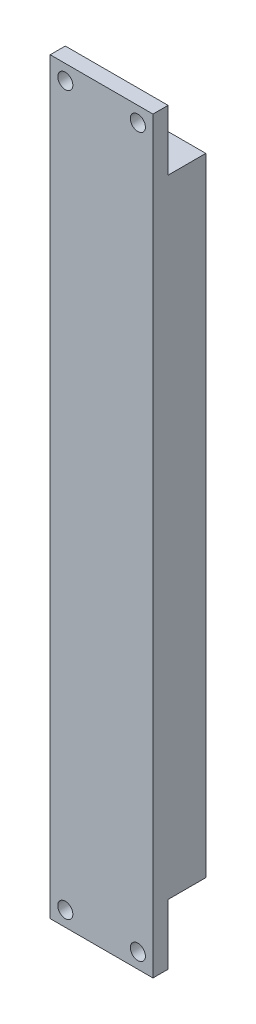
ISO-10303-21;
HEADER;
FILE_DESCRIPTION(('STEP AP214'),'2;1');
FILE_NAME('part.step','',(''),(''),'','','');
FILE_SCHEMA(('AUTOMOTIVE_DESIGN { 1 0 10303 214 1 1 1 1 }'));
ENDSEC;
DATA;
#1=APPLICATION_CONTEXT('core data for automotive mechanical design processes');
#2=APPLICATION_PROTOCOL_DEFINITION('international standard','automotive_design',2000,#1);
#3=PRODUCT_CONTEXT('',#1,'mechanical');
#4=PRODUCT('Part','Part','',(#3));
#5=PRODUCT_RELATED_PRODUCT_CATEGORY('part','',(#4));
#6=PRODUCT_DEFINITION_FORMATION('','',#4);
#7=PRODUCT_DEFINITION_CONTEXT('part definition',#1,'design');
#8=PRODUCT_DEFINITION('design','',#6,#7);
#9=PRODUCT_DEFINITION_SHAPE('','',#8);
#10=(LENGTH_UNIT() NAMED_UNIT(*) SI_UNIT(.MILLI.,.METRE.));
#11=(NAMED_UNIT(*) PLANE_ANGLE_UNIT() SI_UNIT($,.RADIAN.));
#12=(NAMED_UNIT(*) SI_UNIT($,.STERADIAN.) SOLID_ANGLE_UNIT());
#13=UNCERTAINTY_MEASURE_WITH_UNIT(LENGTH_MEASURE(1.E-05),#10,'distance_accuracy_value','');
#14=(GEOMETRIC_REPRESENTATION_CONTEXT(3) GLOBAL_UNCERTAINTY_ASSIGNED_CONTEXT((#13)) GLOBAL_UNIT_ASSIGNED_CONTEXT((#10,
#11,#12)) REPRESENTATION_CONTEXT('',''));
#15=CARTESIAN_POINT('',(0.,0.,0.));
#16=DIRECTION('',(0.,0.,1.));
#17=DIRECTION('',(1.,0.,0.));
#18=AXIS2_PLACEMENT_3D('',#15,#16,#17);
#19=CARTESIAN_POINT('',(0.,0.,0.));
#20=DIRECTION('',(0.,0.,1.));
#21=DIRECTION('',(1.,0.,0.));
#22=AXIS2_PLACEMENT_3D('',#19,#20,#21);
#23=PLANE('',#22);
#24=CARTESIAN_POINT('',(7.62,75.4126,0.));
#25=DIRECTION('',(0.,0.,1.));
#26=DIRECTION('',(1.,0.,0.));
#27=AXIS2_PLACEMENT_3D('',#24,#25,#26);
#28=CIRCLE('',#27,1.5875);
#29=CARTESIAN_POINT('',(9.2075,75.4126,0.));
#30=VERTEX_POINT('',#29);
#31=EDGE_CURVE('E315',#30,#30,#28,.T.);
#32=ORIENTED_EDGE('',*,*,#31,.T.);
#33=EDGE_LOOP('',(#32));
#34=FACE_BOUND('',#33,.T.);
#35=CARTESIAN_POINT('',(-7.62,75.4126,0.));
#36=DIRECTION('',(0.,0.,1.));
#37=DIRECTION('',(1.,0.,0.));
#38=AXIS2_PLACEMENT_3D('',#35,#36,#37);
#39=CIRCLE('',#38,1.5875);
#40=CARTESIAN_POINT('',(-6.0325,75.4126,0.));
#41=VERTEX_POINT('',#40);
#42=EDGE_CURVE('E319',#41,#41,#39,.T.);
#43=ORIENTED_EDGE('',*,*,#42,.T.);
#44=EDGE_LOOP('',(#43));
#45=FACE_BOUND('',#44,.T.);
#46=DIRECTION('',(1.,0.,0.));
#47=VECTOR('',#46,1.);
#48=CARTESIAN_POINT('',(10.795,65.8876,0.));
#49=LINE('',#48,#47);
#50=CARTESIAN_POINT('',(-10.795,65.8876,0.));
#51=VERTEX_POINT('',#50);
#52=CARTESIAN_POINT('',(10.795,65.8876,0.));
#53=VERTEX_POINT('',#52);
#54=EDGE_CURVE('E118',#51,#53,#49,.T.);
#55=ORIENTED_EDGE('',*,*,#54,.F.);
#56=DIRECTION('',(0.,-1.,0.));
#57=VECTOR('',#56,1.);
#58=CARTESIAN_POINT('',(-10.795,-78.5876,0.));
#59=LINE('',#58,#57);
#60=CARTESIAN_POINT('',(-10.795,78.5876,0.));
#61=VERTEX_POINT('',#60);
#62=EDGE_CURVE('E125',#61,#51,#59,.T.);
#63=ORIENTED_EDGE('',*,*,#62,.F.);
#64=DIRECTION('',(-1.,0.,0.));
#65=VECTOR('',#64,1.);
#66=CARTESIAN_POINT('',(10.795,78.5876,0.));
#67=LINE('',#66,#65);
#68=CARTESIAN_POINT('',(10.795,78.5876,0.));
#69=VERTEX_POINT('',#68);
#70=EDGE_CURVE('E135',#69,#61,#67,.T.);
#71=ORIENTED_EDGE('',*,*,#70,.F.);
#72=DIRECTION('',(0.,1.,0.));
#73=VECTOR('',#72,1.);
#74=CARTESIAN_POINT('',(10.795,-78.5876,0.));
#75=LINE('',#74,#73);
#76=EDGE_CURVE('E48',#53,#69,#75,.T.);
#77=ORIENTED_EDGE('',*,*,#76,.F.);
#78=EDGE_LOOP('',(#55,#63,#71,#77));
#79=FACE_BOUND('',#78,.T.);
#80=ADVANCED_FACE('F33',(#34,#45,#79),#23,.F.);
#81=CARTESIAN_POINT('',(-7.62,-75.4126,0.));
#82=DIRECTION('',(0.,0.,1.));
#83=DIRECTION('',(1.,0.,0.));
#84=AXIS2_PLACEMENT_3D('',#81,#82,#83);
#85=CIRCLE('',#84,1.5875);
#86=CARTESIAN_POINT('',(-6.0325,-75.4126,0.));
#87=VERTEX_POINT('',#86);
#88=EDGE_CURVE('E168',#87,#87,#85,.T.);
#89=ORIENTED_EDGE('',*,*,#88,.T.);
#90=EDGE_LOOP('',(#89));
#91=FACE_BOUND('',#90,.T.);
#92=CARTESIAN_POINT('',(7.62,-75.4126,0.));
#93=DIRECTION('',(0.,0.,1.));
#94=DIRECTION('',(1.,0.,0.));
#95=AXIS2_PLACEMENT_3D('',#92,#93,#94);
#96=CIRCLE('',#95,1.5875);
#97=CARTESIAN_POINT('',(9.2075,-75.4126,0.));
#98=VERTEX_POINT('',#97);
#99=EDGE_CURVE('E312',#98,#98,#96,.T.);
#100=ORIENTED_EDGE('',*,*,#99,.T.);
#101=EDGE_LOOP('',(#100));
#102=FACE_BOUND('',#101,.T.);
#103=DIRECTION('',(-1.,0.,0.));
#104=VECTOR('',#103,1.);
#105=CARTESIAN_POINT('',(10.795,-65.8876,0.));
#106=LINE('',#105,#104);
#107=CARTESIAN_POINT('',(10.795,-65.8876,0.));
#108=VERTEX_POINT('',#107);
#109=CARTESIAN_POINT('',(-10.795,-65.8876,0.));
#110=VERTEX_POINT('',#109);
#111=EDGE_CURVE('E56',#108,#110,#106,.T.);
#112=ORIENTED_EDGE('',*,*,#111,.F.);
#113=CARTESIAN_POINT('',(10.795,-78.5876,0.));
#114=VERTEX_POINT('',#113);
#115=EDGE_CURVE('E122',#114,#108,#75,.T.);
#116=ORIENTED_EDGE('',*,*,#115,.F.);
#117=DIRECTION('',(1.,0.,0.));
#118=VECTOR('',#117,1.);
#119=CARTESIAN_POINT('',(10.795,-78.5876,0.));
#120=LINE('',#119,#118);
#121=CARTESIAN_POINT('',(-10.795,-78.5876,0.));
#122=VERTEX_POINT('',#121);
#123=EDGE_CURVE('E143',#122,#114,#120,.T.);
#124=ORIENTED_EDGE('',*,*,#123,.F.);
#125=EDGE_CURVE('E123',#110,#122,#59,.T.);
#126=ORIENTED_EDGE('',*,*,#125,.F.);
#127=EDGE_LOOP('',(#112,#116,#124,#126));
#128=FACE_BOUND('',#127,.T.);
#129=ADVANCED_FACE('F156',(#91,#102,#128),#23,.F.);
#130=CARTESIAN_POINT('',(-10.795,-78.5876,3.175));
#131=DIRECTION('',(1.,0.,0.));
#132=DIRECTION('',(0.,0.,-1.));
#133=AXIS2_PLACEMENT_3D('',#130,#131,#132);
#134=PLANE('',#133);
#135=ORIENTED_EDGE('',*,*,#62,.T.);
#136=DIRECTION('',(0.,0.,1.));
#137=VECTOR('',#136,1.);
#138=CARTESIAN_POINT('',(-10.795,65.8876,-7.9248));
#139=LINE('',#138,#137);
#140=CARTESIAN_POINT('',(-10.795,65.8876,-7.9248));
#141=VERTEX_POINT('',#140);
#142=EDGE_CURVE('E127',#141,#51,#139,.T.);
#143=ORIENTED_EDGE('',*,*,#142,.F.);
#144=DIRECTION('',(0.,1.,0.));
#145=VECTOR('',#144,1.);
#146=CARTESIAN_POINT('',(-10.795,65.8876,-7.9248));
#147=LINE('',#146,#145);
#148=CARTESIAN_POINT('',(-10.795,-65.8876,-7.9248));
#149=VERTEX_POINT('',#148);
#150=EDGE_CURVE('E108',#149,#141,#147,.T.);
#151=ORIENTED_EDGE('',*,*,#150,.F.);
#152=DIRECTION('',(0.,0.,1.));
#153=VECTOR('',#152,1.);
#154=CARTESIAN_POINT('',(-10.795,-65.8876,-7.9248));
#155=LINE('',#154,#153);
#156=EDGE_CURVE('E105',#149,#110,#155,.T.);
#157=ORIENTED_EDGE('',*,*,#156,.T.);
#158=ORIENTED_EDGE('',*,*,#125,.T.);
#159=DIRECTION('',(0.,0.,-1.));
#160=VECTOR('',#159,1.);
#161=CARTESIAN_POINT('',(-10.795,-78.5876,3.175));
#162=LINE('',#161,#160);
#163=CARTESIAN_POINT('',(-10.795,-78.5876,3.175));
#164=VERTEX_POINT('',#163);
#165=EDGE_CURVE('E11',#164,#122,#162,.T.);
#166=ORIENTED_EDGE('',*,*,#165,.F.);
#167=DIRECTION('',(0.,-1.,0.));
#168=VECTOR('',#167,1.);
#169=CARTESIAN_POINT('',(-10.795,-78.5876,3.175));
#170=LINE('',#169,#168);
#171=CARTESIAN_POINT('',(-10.795,78.5876,3.175));
#172=VERTEX_POINT('',#171);
#173=EDGE_CURVE('E131',#172,#164,#170,.T.);
#174=ORIENTED_EDGE('',*,*,#173,.F.);
#175=DIRECTION('',(0.,0.,-1.));
#176=VECTOR('',#175,1.);
#177=CARTESIAN_POINT('',(-10.795,78.5876,3.175));
#178=LINE('',#177,#176);
#179=EDGE_CURVE('E140',#172,#61,#178,.T.);
#180=ORIENTED_EDGE('',*,*,#179,.T.);
#181=EDGE_LOOP('',(#135,#143,#151,#157,#158,#166,#174,#180));
#182=FACE_BOUND('',#181,.T.);
#183=ADVANCED_FACE('F35',(#182),#134,.F.);
#184=CARTESIAN_POINT('',(10.795,-78.5876,3.175));
#185=DIRECTION('',(0.,1.,0.));
#186=DIRECTION('',(-1.,0.,0.));
#187=AXIS2_PLACEMENT_3D('',#184,#185,#186);
#188=PLANE('',#187);
#189=ORIENTED_EDGE('',*,*,#123,.T.);
#190=DIRECTION('',(0.,0.,-1.));
#191=VECTOR('',#190,1.);
#192=CARTESIAN_POINT('',(10.795,-78.5876,3.175));
#193=LINE('',#192,#191);
#194=CARTESIAN_POINT('',(10.795,-78.5876,3.175));
#195=VERTEX_POINT('',#194);
#196=EDGE_CURVE('E41',#195,#114,#193,.T.);
#197=ORIENTED_EDGE('',*,*,#196,.F.);
#198=DIRECTION('',(1.,0.,0.));
#199=VECTOR('',#198,1.);
#200=CARTESIAN_POINT('',(10.795,-78.5876,3.175));
#201=LINE('',#200,#199);
#202=EDGE_CURVE('E134',#164,#195,#201,.T.);
#203=ORIENTED_EDGE('',*,*,#202,.F.);
#204=ORIENTED_EDGE('',*,*,#165,.T.);
#205=EDGE_LOOP('',(#189,#197,#203,#204));
#206=FACE_BOUND('',#205,.T.);
#207=ADVANCED_FACE('F158',(#206),#188,.F.);
#208=CARTESIAN_POINT('',(10.795,-78.5876,3.175));
#209=DIRECTION('',(-1.,0.,0.));
#210=DIRECTION('',(0.,0.,1.));
#211=AXIS2_PLACEMENT_3D('',#208,#209,#210);
#212=PLANE('',#211);
#213=ORIENTED_EDGE('',*,*,#115,.T.);
#214=DIRECTION('',(0.,0.,1.));
#215=VECTOR('',#214,1.);
#216=CARTESIAN_POINT('',(10.795,-65.8876,-7.9248));
#217=LINE('',#216,#215);
#218=CARTESIAN_POINT('',(10.795,-65.8876,-7.9248));
#219=VERTEX_POINT('',#218);
#220=EDGE_CURVE('E103',#219,#108,#217,.T.);
#221=ORIENTED_EDGE('',*,*,#220,.F.);
#222=DIRECTION('',(0.,-1.,0.));
#223=VECTOR('',#222,1.);
#224=CARTESIAN_POINT('',(10.795,65.8876,-7.9248));
#225=LINE('',#224,#223);
#226=CARTESIAN_POINT('',(10.795,65.8876,-7.9248));
#227=VERTEX_POINT('',#226);
#228=EDGE_CURVE('E109',#227,#219,#225,.T.);
#229=ORIENTED_EDGE('',*,*,#228,.F.);
#230=DIRECTION('',(0.,0.,1.));
#231=VECTOR('',#230,1.);
#232=CARTESIAN_POINT('',(10.795,65.8876,-7.9248));
#233=LINE('',#232,#231);
#234=EDGE_CURVE('E164',#227,#53,#233,.T.);
#235=ORIENTED_EDGE('',*,*,#234,.T.);
#236=ORIENTED_EDGE('',*,*,#76,.T.);
#237=DIRECTION('',(0.,0.,-1.));
#238=VECTOR('',#237,1.);
#239=CARTESIAN_POINT('',(10.795,78.5876,3.175));
#240=LINE('',#239,#238);
#241=CARTESIAN_POINT('',(10.795,78.5876,3.175));
#242=VERTEX_POINT('',#241);
#243=EDGE_CURVE('E149',#242,#69,#240,.T.);
#244=ORIENTED_EDGE('',*,*,#243,.F.);
#245=DIRECTION('',(0.,1.,0.));
#246=VECTOR('',#245,1.);
#247=CARTESIAN_POINT('',(10.795,-78.5876,3.175));
#248=LINE('',#247,#246);
#249=EDGE_CURVE('E137',#195,#242,#248,.T.);
#250=ORIENTED_EDGE('',*,*,#249,.F.);
#251=ORIENTED_EDGE('',*,*,#196,.T.);
#252=EDGE_LOOP('',(#213,#221,#229,#235,#236,#244,#250,#251));
#253=FACE_BOUND('',#252,.T.);
#254=ADVANCED_FACE('F120',(#253),#212,.F.);
#255=CARTESIAN_POINT('',(10.795,78.5876,3.175));
#256=DIRECTION('',(0.,-1.,0.));
#257=DIRECTION('',(0.,0.,-1.));
#258=AXIS2_PLACEMENT_3D('',#255,#256,#257);
#259=PLANE('',#258);
#260=ORIENTED_EDGE('',*,*,#70,.T.);
#261=ORIENTED_EDGE('',*,*,#179,.F.);
#262=DIRECTION('',(-1.,0.,0.));
#263=VECTOR('',#262,1.);
#264=CARTESIAN_POINT('',(10.795,78.5876,3.175));
#265=LINE('',#264,#263);
#266=EDGE_CURVE('E139',#242,#172,#265,.T.);
#267=ORIENTED_EDGE('',*,*,#266,.F.);
#268=ORIENTED_EDGE('',*,*,#243,.T.);
#269=EDGE_LOOP('',(#260,#261,#267,#268));
#270=FACE_BOUND('',#269,.T.);
#271=ADVANCED_FACE('F174',(#270),#259,.F.);
#272=CARTESIAN_POINT('',(0.,0.,3.175));
#273=DIRECTION('',(0.,0.,1.));
#274=DIRECTION('',(1.,0.,0.));
#275=AXIS2_PLACEMENT_3D('',#272,#273,#274);
#276=PLANE('',#275);
#277=CARTESIAN_POINT('',(-7.62,-75.4126,3.175));
#278=DIRECTION('',(0.,0.,1.));
#279=DIRECTION('',(-1.,0.,0.));
#280=AXIS2_PLACEMENT_3D('',#277,#278,#279);
#281=CIRCLE('',#280,1.5875);
#282=CARTESIAN_POINT('',(-9.2075,-75.4126,3.175));
#283=VERTEX_POINT('',#282);
#284=EDGE_CURVE('E309',#283,#283,#281,.T.);
#285=ORIENTED_EDGE('',*,*,#284,.F.);
#286=EDGE_LOOP('',(#285));
#287=FACE_BOUND('',#286,.T.);
#288=CARTESIAN_POINT('',(7.62,-75.4126,3.175));
#289=DIRECTION('',(0.,0.,1.));
#290=DIRECTION('',(1.,0.,0.));
#291=AXIS2_PLACEMENT_3D('',#288,#289,#290);
#292=CIRCLE('',#291,1.5875);
#293=CARTESIAN_POINT('',(9.2075,-75.4126,3.175));
#294=VERTEX_POINT('',#293);
#295=EDGE_CURVE('E327',#294,#294,#292,.T.);
#296=ORIENTED_EDGE('',*,*,#295,.F.);
#297=EDGE_LOOP('',(#296));
#298=FACE_BOUND('',#297,.T.);
#299=CARTESIAN_POINT('',(7.62,75.4126,3.175));
#300=DIRECTION('',(0.,0.,1.));
#301=DIRECTION('',(-1.,0.,0.));
#302=AXIS2_PLACEMENT_3D('',#299,#300,#301);
#303=CIRCLE('',#302,1.5875);
#304=CARTESIAN_POINT('',(6.0325,75.4126,3.175));
#305=VERTEX_POINT('',#304);
#306=EDGE_CURVE('E325',#305,#305,#303,.T.);
#307=ORIENTED_EDGE('',*,*,#306,.F.);
#308=EDGE_LOOP('',(#307));
#309=FACE_BOUND('',#308,.T.);
#310=CARTESIAN_POINT('',(-7.62,75.4126,3.175));
#311=DIRECTION('',(0.,0.,1.));
#312=DIRECTION('',(1.,0.,0.));
#313=AXIS2_PLACEMENT_3D('',#310,#311,#312);
#314=CIRCLE('',#313,1.5875);
#315=CARTESIAN_POINT('',(-6.0325,75.4126,3.175));
#316=VERTEX_POINT('',#315);
#317=EDGE_CURVE('E322',#316,#316,#314,.T.);
#318=ORIENTED_EDGE('',*,*,#317,.F.);
#319=EDGE_LOOP('',(#318));
#320=FACE_BOUND('',#319,.T.);
#321=ORIENTED_EDGE('',*,*,#173,.T.);
#322=ORIENTED_EDGE('',*,*,#202,.T.);
#323=ORIENTED_EDGE('',*,*,#249,.T.);
#324=ORIENTED_EDGE('',*,*,#266,.T.);
#325=EDGE_LOOP('',(#321,#322,#323,#324));
#326=FACE_BOUND('',#325,.T.);
#327=ADVANCED_FACE('F188',(#287,#298,#309,#320,#326),#276,.T.);
#328=CARTESIAN_POINT('',(10.795,-65.8876,-7.9248));
#329=DIRECTION('',(0.,1.,0.));
#330=DIRECTION('',(-1.,0.,0.));
#331=AXIS2_PLACEMENT_3D('',#328,#329,#330);
#332=PLANE('',#331);
#333=ORIENTED_EDGE('',*,*,#111,.T.);
#334=ORIENTED_EDGE('',*,*,#156,.F.);
#335=DIRECTION('',(-1.,0.,0.));
#336=VECTOR('',#335,1.);
#337=CARTESIAN_POINT('',(10.795,-65.8876,-7.9248));
#338=LINE('',#337,#336);
#339=EDGE_CURVE('E99',#219,#149,#338,.T.);
#340=ORIENTED_EDGE('',*,*,#339,.F.);
#341=ORIENTED_EDGE('',*,*,#220,.T.);
#342=EDGE_LOOP('',(#333,#334,#340,#341));
#343=FACE_BOUND('',#342,.T.);
#344=ADVANCED_FACE('F101',(#343),#332,.F.);
#345=CARTESIAN_POINT('',(10.795,65.8876,-7.9248));
#346=DIRECTION('',(0.,-1.,0.));
#347=DIRECTION('',(0.,0.,-1.));
#348=AXIS2_PLACEMENT_3D('',#345,#346,#347);
#349=PLANE('',#348);
#350=ORIENTED_EDGE('',*,*,#54,.T.);
#351=ORIENTED_EDGE('',*,*,#234,.F.);
#352=DIRECTION('',(1.,0.,0.));
#353=VECTOR('',#352,1.);
#354=CARTESIAN_POINT('',(10.795,65.8876,-7.9248));
#355=LINE('',#354,#353);
#356=EDGE_CURVE('E114',#141,#227,#355,.T.);
#357=ORIENTED_EDGE('',*,*,#356,.F.);
#358=ORIENTED_EDGE('',*,*,#142,.T.);
#359=EDGE_LOOP('',(#350,#351,#357,#358));
#360=FACE_BOUND('',#359,.T.);
#361=ADVANCED_FACE('F171',(#360),#349,.F.);
#362=CARTESIAN_POINT('',(0.,0.,-7.9248));
#363=DIRECTION('',(0.,0.,-1.));
#364=DIRECTION('',(-1.,0.,0.));
#365=AXIS2_PLACEMENT_3D('',#362,#363,#364);
#366=PLANE('',#365);
#367=ORIENTED_EDGE('',*,*,#228,.T.);
#368=ORIENTED_EDGE('',*,*,#339,.T.);
#369=ORIENTED_EDGE('',*,*,#150,.T.);
#370=ORIENTED_EDGE('',*,*,#356,.T.);
#371=EDGE_LOOP('',(#367,#368,#369,#370));
#372=FACE_BOUND('',#371,.T.);
#373=ADVANCED_FACE('F112',(#372),#366,.T.);
#374=CARTESIAN_POINT('',(-7.62,75.4126,-1.6002));
#375=DIRECTION('',(0.,0.,1.));
#376=DIRECTION('',(1.,0.,0.));
#377=AXIS2_PLACEMENT_3D('',#374,#375,#376);
#378=CYLINDRICAL_SURFACE('',#377,1.5875);
#379=ORIENTED_EDGE('',*,*,#317,.T.);
#380=EDGE_LOOP('',(#379));
#381=FACE_BOUND('',#380,.T.);
#382=ORIENTED_EDGE('',*,*,#42,.F.);
#383=EDGE_LOOP('',(#382));
#384=FACE_BOUND('',#383,.T.);
#385=ADVANCED_FACE('F223',(#381,#384),#378,.F.);
#386=CARTESIAN_POINT('',(7.62,75.4126,-1.6002));
#387=DIRECTION('',(0.,0.,1.));
#388=DIRECTION('',(1.,0.,0.));
#389=AXIS2_PLACEMENT_3D('',#386,#387,#388);
#390=CYLINDRICAL_SURFACE('',#389,1.5875);
#391=ORIENTED_EDGE('',*,*,#306,.T.);
#392=EDGE_LOOP('',(#391));
#393=FACE_BOUND('',#392,.T.);
#394=ORIENTED_EDGE('',*,*,#31,.F.);
#395=EDGE_LOOP('',(#394));
#396=FACE_BOUND('',#395,.T.);
#397=ADVANCED_FACE('F228',(#393,#396),#390,.F.);
#398=CARTESIAN_POINT('',(7.62,-75.4126,-1.6002));
#399=DIRECTION('',(0.,0.,1.));
#400=DIRECTION('',(1.,0.,0.));
#401=AXIS2_PLACEMENT_3D('',#398,#399,#400);
#402=CYLINDRICAL_SURFACE('',#401,1.5875);
#403=ORIENTED_EDGE('',*,*,#295,.T.);
#404=EDGE_LOOP('',(#403));
#405=FACE_BOUND('',#404,.T.);
#406=ORIENTED_EDGE('',*,*,#99,.F.);
#407=EDGE_LOOP('',(#406));
#408=FACE_BOUND('',#407,.T.);
#409=ADVANCED_FACE('F240',(#405,#408),#402,.F.);
#410=CARTESIAN_POINT('',(-7.62,-75.4126,-1.6002));
#411=DIRECTION('',(0.,0.,1.));
#412=DIRECTION('',(1.,0.,0.));
#413=AXIS2_PLACEMENT_3D('',#410,#411,#412);
#414=CYLINDRICAL_SURFACE('',#413,1.5875);
#415=ORIENTED_EDGE('',*,*,#284,.T.);
#416=EDGE_LOOP('',(#415));
#417=FACE_BOUND('',#416,.T.);
#418=ORIENTED_EDGE('',*,*,#88,.F.);
#419=EDGE_LOOP('',(#418));
#420=FACE_BOUND('',#419,.T.);
#421=ADVANCED_FACE('F250',(#417,#420),#414,.F.);
#422=CLOSED_SHELL('',(#80,#129,#183,#207,#254,#271,#327,#344,#361,#373,#385,#397,#409,#421));
#423=MANIFOLD_SOLID_BREP('B2',#422);
#424=ADVANCED_BREP_SHAPE_REPRESENTATION('',(#18,#423),#14);
#425=SHAPE_DEFINITION_REPRESENTATION(#9,#424);
ENDSEC;
END-ISO-10303-21;
